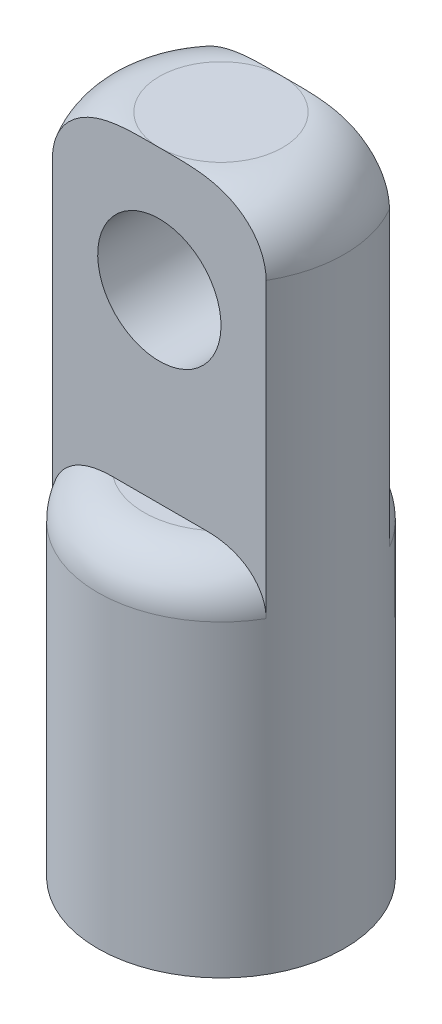
ISO-10303-21;
HEADER;
FILE_DESCRIPTION(('STEP AP214'),'2;1');
FILE_NAME('part.step','',(''),(''),'','','');
FILE_SCHEMA(('AUTOMOTIVE_DESIGN { 1 0 10303 214 1 1 1 1 }'));
ENDSEC;
DATA;
#1=APPLICATION_CONTEXT('core data for automotive mechanical design processes');
#2=APPLICATION_PROTOCOL_DEFINITION('international standard','automotive_design',2000,#1);
#3=PRODUCT_CONTEXT('',#1,'mechanical');
#4=PRODUCT('Part','Part','',(#3));
#5=PRODUCT_RELATED_PRODUCT_CATEGORY('part','',(#4));
#6=PRODUCT_DEFINITION_FORMATION('','',#4);
#7=PRODUCT_DEFINITION_CONTEXT('part definition',#1,'design');
#8=PRODUCT_DEFINITION('design','',#6,#7);
#9=PRODUCT_DEFINITION_SHAPE('','',#8);
#10=(LENGTH_UNIT() NAMED_UNIT(*) SI_UNIT(.MILLI.,.METRE.));
#11=(NAMED_UNIT(*) PLANE_ANGLE_UNIT() SI_UNIT($,.RADIAN.));
#12=(NAMED_UNIT(*) SI_UNIT($,.STERADIAN.) SOLID_ANGLE_UNIT());
#13=UNCERTAINTY_MEASURE_WITH_UNIT(LENGTH_MEASURE(1.E-05),#10,'distance_accuracy_value','');
#14=(GEOMETRIC_REPRESENTATION_CONTEXT(3) GLOBAL_UNCERTAINTY_ASSIGNED_CONTEXT((#13)) GLOBAL_UNIT_ASSIGNED_CONTEXT((#10,
#11,#12)) REPRESENTATION_CONTEXT('',''));
#15=CARTESIAN_POINT('',(0.,0.,0.));
#16=DIRECTION('',(0.,0.,1.));
#17=DIRECTION('',(1.,0.,0.));
#18=AXIS2_PLACEMENT_3D('',#15,#16,#17);
#19=CARTESIAN_POINT('',(0.,43.,0.));
#20=DIRECTION('',(0.,-1.,0.));
#21=DIRECTION('',(0.,0.,-1.));
#22=AXIS2_PLACEMENT_3D('',#19,#20,#21);
#23=CYLINDRICAL_SURFACE('',#22,8.);
#24=DIRECTION('',(0.,-1.,0.));
#25=VECTOR('',#24,1.);
#26=CARTESIAN_POINT('',(6.92820323027551,43.,-4.));
#27=LINE('',#26,#25);
#28=CARTESIAN_POINT('',(6.92820323027551,20.,-4.));
#29=VERTEX_POINT('',#28);
#30=CARTESIAN_POINT('',(6.92820323027551,39.,-4.));
#31=VERTEX_POINT('',#30);
#32=EDGE_CURVE('E111',#29,#31,#27,.F.);
#33=ORIENTED_EDGE('',*,*,#32,.T.);
#34=CARTESIAN_POINT('',(0.,39.,0.));
#35=DIRECTION('',(0.,1.,0.));
#36=DIRECTION('',(0.,0.,1.));
#37=AXIS2_PLACEMENT_3D('',#34,#35,#36);
#38=CIRCLE('',#37,8.);
#39=CARTESIAN_POINT('',(6.92820323027551,39.,4.));
#40=VERTEX_POINT('',#39);
#41=EDGE_CURVE('E57',#31,#40,#38,.F.);
#42=ORIENTED_EDGE('',*,*,#41,.T.);
#43=DIRECTION('',(0.,-1.,0.));
#44=VECTOR('',#43,1.);
#45=CARTESIAN_POINT('',(6.92820323027551,43.,4.));
#46=LINE('',#45,#44);
#47=CARTESIAN_POINT('',(6.92820323027551,20.,4.));
#48=VERTEX_POINT('',#47);
#49=EDGE_CURVE('E137',#40,#48,#46,.T.);
#50=ORIENTED_EDGE('',*,*,#49,.T.);
#51=CARTESIAN_POINT('',(0.,20.,0.));
#52=DIRECTION('',(0.,-1.,0.));
#53=DIRECTION('',(0.,0.,-1.));
#54=AXIS2_PLACEMENT_3D('',#51,#52,#53);
#55=CIRCLE('',#54,8.);
#56=CARTESIAN_POINT('',(-6.92820323027551,20.,4.));
#57=VERTEX_POINT('',#56);
#58=EDGE_CURVE('E128',#48,#57,#55,.T.);
#59=ORIENTED_EDGE('',*,*,#58,.T.);
#60=DIRECTION('',(0.,-1.,0.));
#61=VECTOR('',#60,1.);
#62=CARTESIAN_POINT('',(-6.92820323027551,43.,4.));
#63=LINE('',#62,#61);
#64=CARTESIAN_POINT('',(-6.92820323027551,39.,4.));
#65=VERTEX_POINT('',#64);
#66=EDGE_CURVE('E110',#57,#65,#63,.F.);
#67=ORIENTED_EDGE('',*,*,#66,.T.);
#68=CARTESIAN_POINT('',(0.,39.,0.));
#69=DIRECTION('',(0.,1.,0.));
#70=DIRECTION('',(0.,0.,1.));
#71=AXIS2_PLACEMENT_3D('',#68,#69,#70);
#72=CIRCLE('',#71,8.);
#73=CARTESIAN_POINT('',(-6.92820323027551,39.,-4.));
#74=VERTEX_POINT('',#73);
#75=EDGE_CURVE('E105',#65,#74,#72,.F.);
#76=ORIENTED_EDGE('',*,*,#75,.T.);
#77=DIRECTION('',(0.,-1.,0.));
#78=VECTOR('',#77,1.);
#79=CARTESIAN_POINT('',(-6.92820323027551,43.,-4.));
#80=LINE('',#79,#78);
#81=CARTESIAN_POINT('',(-6.92820323027551,20.,-4.));
#82=VERTEX_POINT('',#81);
#83=EDGE_CURVE('E99',#74,#82,#80,.T.);
#84=ORIENTED_EDGE('',*,*,#83,.T.);
#85=CARTESIAN_POINT('',(0.,20.,0.));
#86=DIRECTION('',(0.,-1.,0.));
#87=DIRECTION('',(0.,0.,-1.));
#88=AXIS2_PLACEMENT_3D('',#85,#86,#87);
#89=CIRCLE('',#88,8.);
#90=EDGE_CURVE('E103',#82,#29,#89,.T.);
#91=ORIENTED_EDGE('',*,*,#90,.T.);
#92=EDGE_LOOP('',(#33,#42,#50,#59,#67,#76,#84,#91));
#93=FACE_BOUND('',#92,.T.);
#94=CARTESIAN_POINT('',(0.,0.,0.));
#95=DIRECTION('',(0.,1.,0.));
#96=DIRECTION('',(0.,0.,1.));
#97=AXIS2_PLACEMENT_3D('',#94,#95,#96);
#98=CIRCLE('',#97,8.);
#99=CARTESIAN_POINT('',(0.,0.,8.));
#100=VERTEX_POINT('',#99);
#101=EDGE_CURVE('E129',#100,#100,#98,.T.);
#102=ORIENTED_EDGE('',*,*,#101,.T.);
#103=EDGE_LOOP('',(#102));
#104=FACE_BOUND('',#103,.T.);
#105=ADVANCED_FACE('F39',(#93,#104),#23,.T.);
#106=CARTESIAN_POINT('',(0.,43.,0.));
#107=DIRECTION('',(0.,1.,0.));
#108=DIRECTION('',(0.,0.,1.));
#109=AXIS2_PLACEMENT_3D('',#106,#107,#108);
#110=PLANE('',#109);
#111=CARTESIAN_POINT('',(0.,43.,0.));
#112=DIRECTION('',(0.,1.,0.));
#113=DIRECTION('',(0.,0.,1.));
#114=AXIS2_PLACEMENT_3D('',#111,#112,#113);
#115=CIRCLE('',#114,4.);
#116=CARTESIAN_POINT('',(0.,43.,-4.));
#117=VERTEX_POINT('',#116);
#118=CARTESIAN_POINT('',(0.,43.,4.));
#119=VERTEX_POINT('',#118);
#120=EDGE_CURVE('E122',#117,#119,#115,.T.);
#121=ORIENTED_EDGE('',*,*,#120,.T.);
#122=CARTESIAN_POINT('',(0.,43.,0.));
#123=DIRECTION('',(0.,1.,0.));
#124=DIRECTION('',(0.,0.,1.));
#125=AXIS2_PLACEMENT_3D('',#122,#123,#124);
#126=CIRCLE('',#125,4.);
#127=EDGE_CURVE('E209',#119,#117,#126,.T.);
#128=ORIENTED_EDGE('',*,*,#127,.T.);
#129=EDGE_LOOP('',(#121,#128));
#130=FACE_BOUND('',#129,.T.);
#131=ADVANCED_FACE('F196',(#130),#110,.T.);
#132=CARTESIAN_POINT('',(0.,0.,0.));
#133=DIRECTION('',(0.,1.,0.));
#134=DIRECTION('',(0.,0.,1.));
#135=AXIS2_PLACEMENT_3D('',#132,#133,#134);
#136=PLANE('',#135);
#137=CARTESIAN_POINT('',(0.,0.,0.));
#138=DIRECTION('',(0.,-1.,0.));
#139=DIRECTION('',(0.,0.,-1.));
#140=AXIS2_PLACEMENT_3D('',#137,#138,#139);
#141=CIRCLE('',#140,4.);
#142=CARTESIAN_POINT('',(0.,0.,-4.));
#143=VERTEX_POINT('',#142);
#144=EDGE_CURVE('E258',#143,#143,#141,.T.);
#145=ORIENTED_EDGE('',*,*,#144,.F.);
#146=EDGE_LOOP('',(#145));
#147=FACE_BOUND('',#146,.T.);
#148=ORIENTED_EDGE('',*,*,#101,.F.);
#149=EDGE_LOOP('',(#148));
#150=FACE_BOUND('',#149,.T.);
#151=ADVANCED_FACE('F289',(#147,#150),#136,.F.);
#152=CARTESIAN_POINT('',(-21.5,23.,-8.));
#153=DIRECTION('',(0.,-1.,0.));
#154=DIRECTION('',(0.,0.,-1.));
#155=AXIS2_PLACEMENT_3D('',#152,#153,#154);
#156=PLANE('',#155);
#157=DIRECTION('',(1.,0.,0.));
#158=VECTOR('',#157,1.);
#159=CARTESIAN_POINT('',(-21.5,23.,-4.));
#160=LINE('',#159,#158);
#161=CARTESIAN_POINT('',(-3.,23.,-4.));
#162=VERTEX_POINT('',#161);
#163=CARTESIAN_POINT('',(3.,23.,-4.));
#164=VERTEX_POINT('',#163);
#165=EDGE_CURVE('E118',#162,#164,#160,.T.);
#166=ORIENTED_EDGE('',*,*,#165,.T.);
#167=CARTESIAN_POINT('',(0.,23.,0.));
#168=DIRECTION('',(0.,-1.,0.));
#169=DIRECTION('',(0.,0.,-1.));
#170=AXIS2_PLACEMENT_3D('',#167,#168,#169);
#171=CIRCLE('',#170,5.);
#172=EDGE_CURVE('E143',#164,#162,#171,.F.);
#173=ORIENTED_EDGE('',*,*,#172,.T.);
#174=EDGE_LOOP('',(#166,#173));
#175=FACE_BOUND('',#174,.T.);
#176=ADVANCED_FACE('F194',(#175),#156,.F.);
#177=CARTESIAN_POINT('',(-21.5,43.,-4.));
#178=DIRECTION('',(0.,0.,1.));
#179=DIRECTION('',(0.,-1.,0.));
#180=AXIS2_PLACEMENT_3D('',#177,#178,#179);
#181=PLANE('',#180);
#182=CARTESIAN_POINT('',(0.,35.,-4.));
#183=DIRECTION('',(0.,0.,1.));
#184=DIRECTION('',(0.,-1.,0.));
#185=AXIS2_PLACEMENT_3D('',#182,#183,#184);
#186=CIRCLE('',#185,4.);
#187=CARTESIAN_POINT('',(0.,31.,-4.));
#188=VERTEX_POINT('',#187);
#189=EDGE_CURVE('E252',#188,#188,#186,.T.);
#190=ORIENTED_EDGE('',*,*,#189,.T.);
#191=EDGE_LOOP('',(#190));
#192=FACE_BOUND('',#191,.T.);
#193=CARTESIAN_POINT('',(-6.92820323027551,39.,-4.));
#194=CARTESIAN_POINT('',(-6.92821776572525,39.0998399111443,-4.));
#195=CARTESIAN_POINT('',(-6.92388723160754,39.1996728618451,-4.));
#196=CARTESIAN_POINT('',(-6.906647552131,39.3985770249255,-4.));
#197=CARTESIAN_POINT('',(-6.89374002173262,39.4976483771546,-4.));
#198=CARTESIAN_POINT('',(-6.85950468274296,39.6940507034913,-4.));
#199=CARTESIAN_POINT('',(-6.83820000104996,39.7913856965822,-4.));
#200=CARTESIAN_POINT('',(-6.78740665520392,39.9838692326013,-4.));
#201=CARTESIAN_POINT('',(-6.75791788751632,40.0790177478524,-4.));
#202=CARTESIAN_POINT('',(-6.65758013373837,40.3601476261152,-4.));
#203=CARTESIAN_POINT('',(-6.57482183418598,40.5420274197596,-4.));
#204=CARTESIAN_POINT('',(-6.38079408621659,40.8897213590252,-4.));
#205=CARTESIAN_POINT('',(-6.26951878887343,41.055532199227,-4.));
#206=CARTESIAN_POINT('',(-6.01890175588109,41.3720723169723,-4.));
#207=CARTESIAN_POINT('',(-5.87885522019734,41.5222423955989,-4.));
#208=CARTESIAN_POINT('',(-5.57755711087018,41.7995318758743,-4.));
#209=CARTESIAN_POINT('',(-5.41629284782276,41.9266373745056,-4.));
#210=CARTESIAN_POINT('',(-5.06022269741182,42.1684660542635,-4.));
#211=CARTESIAN_POINT('',(-4.86367344855326,42.2806090561814,-4.));
#212=CARTESIAN_POINT('',(-4.45717854161851,42.476146937675,-4.));
#213=CARTESIAN_POINT('',(-4.24724433860506,42.5595660184323,-4.));
#214=CARTESIAN_POINT('',(-3.84336634720423,42.6923183290874,-4.));
#215=CARTESIAN_POINT('',(-3.65031767030763,42.74444835051,-4.));
#216=CARTESIAN_POINT('',(-3.26023127878528,42.8310128825349,-4.));
#217=CARTESIAN_POINT('',(-3.06319062513511,42.8654338236988,-4.));
#218=CARTESIAN_POINT('',(-2.46673820887158,42.9475472888336,-4.));
#219=CARTESIAN_POINT('',(-2.06447214576943,42.9733763896873,-4.));
#220=CARTESIAN_POINT('',(-1.52297472200008,42.9906786600553,-4.));
#221=CARTESIAN_POINT('',(-1.38356663355005,42.9935726212859,-4.));
#222=CARTESIAN_POINT('',(-1.10470452891646,42.997490418453,-4.));
#223=CARTESIAN_POINT('',(-0.965250517883453,42.9985144197157,-4.));
#224=CARTESIAN_POINT('',(-0.688164141979116,42.9996987371187,-4.));
#225=CARTESIAN_POINT('',(-0.550531671165758,42.9998701116947,-4.));
#226=CARTESIAN_POINT('',(-0.344082100049704,42.9999802422005,-4.));
#227=CARTESIAN_POINT('',(-0.27526620443901,42.9999924644965,-4.));
#228=CARTESIAN_POINT('',(-0.137633406118068,43.0000004488545,-4.));
#229=CARTESIAN_POINT('',(-0.068816503407787,42.999996210676,-4.));
#230=CARTESIAN_POINT('',(0.,43.,-4.));
#231=B_SPLINE_CURVE_WITH_KNOTS('',3,(#193,#194,#195,#196,#197,#198,#199,#200,#201,#202,#203,
#204,#205,#206,#207,#208,#209,#210,#211,#212,#213,#214,#215,#216,#217,#218,#219,#220,#221,#222,
#223,#224,#225,#226,#227,#228,#229,#230),.UNSPECIFIED.,.F.,.F.,(4,2,2,2,2,2,2,2,2,2,2,2,2,2,2,2,
2,2,4),(0.,0.299413909240484,0.59877145788006,0.897310232380029,1.195852783782,1.79229394062821,
2.38885752747876,3.00229397422898,3.61609897267758,4.29242836735668,4.96818652204701,
5.56712678431675,6.16652529871814,7.37296410521326,7.79134521533999,8.20968933390621,
8.62259318706088,8.82904048026419,9.03549078799542),.UNSPECIFIED.);
#232=EDGE_CURVE('E202',#74,#117,#231,.T.);
#233=ORIENTED_EDGE('',*,*,#232,.T.);
#234=CARTESIAN_POINT('',(0.,43.,-4.));
#235=CARTESIAN_POINT('',(0.081934372443785,42.9999901621517,-4.));
#236=CARTESIAN_POINT('',(0.163868719645012,42.9999997722504,-4.));
#237=CARTESIAN_POINT('',(0.327737805392751,42.9999859949028,-4.));
#238=CARTESIAN_POINT('',(0.409672543939226,42.9999626072957,-4.));
#239=CARTESIAN_POINT('',(0.573570543917074,42.9998109134264,-4.));
#240=CARTESIAN_POINT('',(0.655533805360718,42.9996825706882,-4.));
#241=CARTESIAN_POINT('',(0.819459431287918,42.9991810018759,-4.));
#242=CARTESIAN_POINT('',(0.901421795771103,42.9988077757041,-4.));
#243=CARTESIAN_POINT('',(1.14971087828171,42.9970462778812,-4.));
#244=CARTESIAN_POINT('',(1.31603543743134,42.9950086297618,-4.));
#245=CARTESIAN_POINT('',(1.64860104925505,42.9873060204224,-4.));
#246=CARTESIAN_POINT('',(1.81484210786678,42.9816413702565,-4.));
#247=CARTESIAN_POINT('',(2.15225389122415,42.9641651516034,-4.));
#248=CARTESIAN_POINT('',(2.32341585058205,42.9521665237094,-4.));
#249=CARTESIAN_POINT('',(2.66496525353369,42.9193839211801,-4.));
#250=CARTESIAN_POINT('',(2.83535258957369,42.8985987620824,-4.));
#251=CARTESIAN_POINT('',(3.17336577789354,42.8460148114359,-4.));
#252=CARTESIAN_POINT('',(3.34100226920973,42.8142863109191,-4.));
#253=CARTESIAN_POINT('',(3.6732189151806,42.7377303589657,-4.));
#254=CARTESIAN_POINT('',(3.83780106037201,42.6929117818376,-4.));
#255=CARTESIAN_POINT('',(4.10928317228068,42.6055533932505,-4.));
#256=CARTESIAN_POINT('',(4.21748448205684,42.5670403097285,-4.));
#257=CARTESIAN_POINT('',(4.43119367088118,42.4828941875974,-4.));
#258=CARTESIAN_POINT('',(4.5366995171093,42.4372559497635,-4.));
#259=CARTESIAN_POINT('',(4.7435746413122,42.33890351358,-4.));
#260=CARTESIAN_POINT('',(4.84496540499679,42.286234656278,-4.));
#261=CARTESIAN_POINT('',(5.04351882719218,42.1734588811268,-4.));
#262=CARTESIAN_POINT('',(5.14068203496346,42.1133529334571,-4.));
#263=CARTESIAN_POINT('',(5.33084233404043,41.9850905467794,-4.));
#264=CARTESIAN_POINT('',(5.42379364032934,41.9168660282979,-4.));
#265=CARTESIAN_POINT('',(5.60367287221488,41.7729559608496,-4.));
#266=CARTESIAN_POINT('',(5.69060355893645,41.697273871113,-4.));
#267=CARTESIAN_POINT('',(5.8577956090825,41.5385089166943,-4.));
#268=CARTESIAN_POINT('',(5.93804212292043,41.4554103810236,-4.));
#269=CARTESIAN_POINT('',(6.09075270962902,41.282401115125,-4.));
#270=CARTESIAN_POINT('',(6.16322032727889,41.1924935198596,-4.));
#271=CARTESIAN_POINT('',(6.29841885913387,41.0079794642972,-4.));
#272=CARTESIAN_POINT('',(6.36129497454657,40.9134795308043,-4.));
#273=CARTESIAN_POINT('',(6.478008414938,40.7191093874048,-4.));
#274=CARTESIAN_POINT('',(6.53185012066076,40.6192418114419,-4.));
#275=CARTESIAN_POINT('',(6.62983314141406,40.4149641819472,-4.));
#276=CARTESIAN_POINT('',(6.67398386175297,40.3105586515818,-4.));
#277=CARTESIAN_POINT('',(6.75208657385242,40.0980553359509,-4.));
#278=CARTESIAN_POINT('',(6.78604185230073,39.989958753106,-4.));
#279=CARTESIAN_POINT('',(6.85224077542441,39.7369052635637,-4.));
#280=CARTESIAN_POINT('',(6.88068089681158,39.5909227529622,-4.));
#281=CARTESIAN_POINT('',(6.90916776843233,39.3702365449814,-4.));
#282=CARTESIAN_POINT('',(6.91630118155305,39.2963752911566,-4.));
#283=CARTESIAN_POINT('',(6.9258187589002,39.1483507577692,-4.));
#284=CARTESIAN_POINT('',(6.92820313405676,39.0741874917672,-4.));
#285=CARTESIAN_POINT('',(6.92820323027551,39.,-4.));
#286=B_SPLINE_CURVE_WITH_KNOTS('',3,(#234,#235,#236,#237,#238,#239,#240,#241,#242,#243,#244,
#245,#246,#247,#248,#249,#250,#251,#252,#253,#254,#255,#256,#257,#258,#259,#260,#261,#262,#263,
#264,#265,#266,#267,#268,#269,#270,#271,#272,#273,#274,#275,#276,#277,#278,#279,#280,#281,#282,
#283,#284,#285),.UNSPECIFIED.,.F.,.F.,(4,2,2,2,2,2,2,2,2,2,2,2,2,2,2,2,2,2,2,2,2,2,2,2,2,4),(0.,
0.245803063149239,0.491607323134588,0.737497045914827,0.983386866876634,1.48237884806241,
1.9813280410932,2.49591247390099,3.01056629704422,3.52197414124778,4.03303608235375,
4.37736922216389,4.7219548064554,5.06441677992871,5.40683412573429,5.75235749828527,
6.09772134594152,6.44383305523808,6.78978636865603,7.12982893983612,7.46970614643276,
7.80925202196232,8.14868832083924,8.59349612486315,8.81598209166226,9.03845817645166),.UNSPECIFIED.);
#287=EDGE_CURVE('E208',#117,#31,#286,.T.);
#288=ORIENTED_EDGE('',*,*,#287,.T.);
#289=ORIENTED_EDGE('',*,*,#32,.F.);
#290=CARTESIAN_POINT('',(6.92820323027551,20.,-4.));
#291=CARTESIAN_POINT('',(6.92821515785234,20.0752775190238,-4.));
#292=CARTESIAN_POINT('',(6.92493181108223,20.1505492919052,-4.));
#293=CARTESIAN_POINT('',(6.91186600404405,20.3005102095571,-4.));
#294=CARTESIAN_POINT('',(6.90208500321219,20.3751994813523,-4.));
#295=CARTESIAN_POINT('',(6.87615954702359,20.5232056612017,-4.));
#296=CARTESIAN_POINT('',(6.86003691523257,20.5965263819242,-4.));
#297=CARTESIAN_POINT('',(6.82161828999906,20.7415122597936,-4.));
#298=CARTESIAN_POINT('',(6.79932217546066,20.8131773844353,-4.));
#299=CARTESIAN_POINT('',(6.72351159434413,21.0248826158747,-4.));
#300=CARTESIAN_POINT('',(6.66104059206544,21.161825161522,-4.));
#301=CARTESIAN_POINT('',(6.51474411865975,21.4237355839381,-4.));
#302=CARTESIAN_POINT('',(6.43090434521203,21.5486953631329,-4.));
#303=CARTESIAN_POINT('',(6.24166906471507,21.7882488572285,-4.));
#304=CARTESIAN_POINT('',(6.13562135211106,21.9023261251878,-4.));
#305=CARTESIAN_POINT('',(5.90770601111562,22.1131163730114,-4.));
#306=CARTESIAN_POINT('',(5.78584584640996,22.2098374942024,-4.));
#307=CARTESIAN_POINT('',(5.51552898292012,22.3951528248614,-4.));
#308=CARTESIAN_POINT('',(5.36562212174723,22.4816220518126,-4.));
#309=CARTESIAN_POINT('',(5.05475755977353,22.632904826468,-4.));
#310=CARTESIAN_POINT('',(4.89376362208769,22.6976428644215,-4.));
#311=CARTESIAN_POINT('',(4.59000989723978,22.7982840230494,-4.));
#312=CARTESIAN_POINT('',(4.44818121058739,22.8370692672232,-4.));
#313=CARTESIAN_POINT('',(4.16133779887817,22.9012546895422,-4.));
#314=CARTESIAN_POINT('',(4.01631852565651,22.9266342705923,-4.));
#315=CARTESIAN_POINT('',(3.72609336968325,22.9654099032293,-4.));
#316=CARTESIAN_POINT('',(3.58090097086085,22.978911989111,-4.));
#317=CARTESIAN_POINT('',(3.29042531426347,22.9962063057846,-4.));
#318=CARTESIAN_POINT('',(3.14514413551115,23.0000322025836,-4.));
#319=CARTESIAN_POINT('',(3.,23.,-4.));
#320=B_SPLINE_CURVE_WITH_KNOTS('',3,(#290,#291,#292,#293,#294,#295,#296,#297,#298,#299,#300,
#301,#302,#303,#304,#305,#306,#307,#308,#309,#310,#311,#312,#313,#314,#315,#316,#317,#318,#319),
.UNSPECIFIED.,.F.,.F.,(4,2,2,2,2,2,2,2,2,2,2,2,2,2,4),(0.,0.22575120161146,0.451451714446731,
0.676382221689015,0.901317141366401,1.35060763244558,1.80019963122215,2.26554049563833,
2.73066250663503,3.24790157623515,3.76691973836386,4.2073338211855,4.64842262307914,
5.08553250731007,5.52111946598815),.UNSPECIFIED.);
#321=EDGE_CURVE('E123',#29,#164,#320,.T.);
#322=ORIENTED_EDGE('',*,*,#321,.T.);
#323=ORIENTED_EDGE('',*,*,#165,.F.);
#324=CARTESIAN_POINT('',(-3.,23.,-4.));
#325=CARTESIAN_POINT('',(-3.08434272344486,23.0000016002259,-4.));
#326=CARTESIAN_POINT('',(-3.16868679855583,22.9987188299357,-4.));
#327=CARTESIAN_POINT('',(-3.33731651653949,22.9931870540305,-4.));
#328=CARTESIAN_POINT('',(-3.42160211075298,22.9889365999714,-4.));
#329=CARTESIAN_POINT('',(-3.67504906760694,22.9710755177816,-4.));
#330=CARTESIAN_POINT('',(-3.84390289401351,22.9523465293852,-4.));
#331=CARTESIAN_POINT('',(-4.18095001020976,22.8980939374492,-4.));
#332=CARTESIAN_POINT('',(-4.34911395744236,22.8623817881528,-4.));
#333=CARTESIAN_POINT('',(-4.67982491206461,22.7717148283789,-4.));
#334=CARTESIAN_POINT('',(-4.84238521427837,22.7168095847979,-4.));
#335=CARTESIAN_POINT('',(-5.1702374673215,22.5812701219929,-4.));
#336=CARTESIAN_POINT('',(-5.3348968054154,22.4990796967319,-4.));
#337=CARTESIAN_POINT('',(-5.6486006857123,22.3098016651211,-4.));
#338=CARTESIAN_POINT('',(-5.79770842343214,22.2028210085389,-4.));
#339=CARTESIAN_POINT('',(-6.00627938118596,22.023702953418,-4.));
#340=CARTESIAN_POINT('',(-6.07357918351382,21.9605339343775,-4.));
#341=CARTESIAN_POINT('',(-6.20210301540641,21.8283072962409,-4.));
#342=CARTESIAN_POINT('',(-6.26332988076576,21.7592524538421,-4.));
#343=CARTESIAN_POINT('',(-6.37902751921047,21.6155436084111,-4.));
#344=CARTESIAN_POINT('',(-6.43348928259466,21.5408823465718,-4.));
#345=CARTESIAN_POINT('',(-6.53482654137611,21.3865797398213,-4.));
#346=CARTESIAN_POINT('',(-6.58170333007885,21.3069392471307,-4.));
#347=CARTESIAN_POINT('',(-6.6626549051383,21.1520467355503,-4.));
#348=CARTESIAN_POINT('',(-6.69756086224048,21.0772281837687,-4.));
#349=CARTESIAN_POINT('',(-6.76036031824398,20.9247076089031,-4.));
#350=CARTESIAN_POINT('',(-6.78825478272786,20.8470059845526,-4.));
#351=CARTESIAN_POINT('',(-6.83663475845921,20.6895080969794,-4.));
#352=CARTESIAN_POINT('',(-6.85713564303521,20.6097165544316,-4.));
#353=CARTESIAN_POINT('',(-6.89053740625693,20.4485962898993,-4.));
#354=CARTESIAN_POINT('',(-6.90344301296172,20.3672685568088,-4.));
#355=CARTESIAN_POINT('',(-6.91771335342593,20.2380964446396,-4.));
#356=CARTESIAN_POINT('',(-6.92164844083313,20.1905222385129,-4.));
#357=CARTESIAN_POINT('',(-6.9268919021678,20.0953009516296,-4.));
#358=CARTESIAN_POINT('',(-6.92820420890376,20.0476540873583,-4.));
#359=CARTESIAN_POINT('',(-6.92820323027601,20.,-4.));
#360=B_SPLINE_CURVE_WITH_KNOTS('',3,(#324,#325,#326,#327,#328,#329,#330,#331,#332,#333,#334,
#335,#336,#337,#338,#339,#340,#341,#342,#343,#344,#345,#346,#347,#348,#349,#350,#351,#352,#353,
#354,#355,#356,#357,#358,#359),.UNSPECIFIED.,.F.,.F.,(4,2,2,2,2,2,2,2,2,2,2,2,2,2,2,2,2,4),(0.,
0.253013430789428,0.506150436802284,1.01511086567278,1.52985855421584,2.04328659031308,
2.5933464679205,3.14107606603442,3.41765749619675,3.69410916088372,3.9709251414229,
4.24769387252929,4.49504100646621,4.74235405848861,4.9891498714192,5.23579189105644,
5.37893661090249,5.52186652650744),.UNSPECIFIED.);
#361=EDGE_CURVE('E115',#162,#82,#360,.T.);
#362=ORIENTED_EDGE('',*,*,#361,.T.);
#363=ORIENTED_EDGE('',*,*,#83,.F.);
#364=EDGE_LOOP('',(#233,#288,#289,#322,#323,#362,#363));
#365=FACE_BOUND('',#364,.T.);
#366=ADVANCED_FACE('F116',(#192,#365),#181,.F.);
#367=CARTESIAN_POINT('',(-21.5,23.,8.));
#368=DIRECTION('',(0.,-1.,0.));
#369=DIRECTION('',(0.,0.,-1.));
#370=AXIS2_PLACEMENT_3D('',#367,#368,#369);
#371=PLANE('',#370);
#372=DIRECTION('',(1.,0.,0.));
#373=VECTOR('',#372,1.);
#374=CARTESIAN_POINT('',(-21.5,23.,4.));
#375=LINE('',#374,#373);
#376=CARTESIAN_POINT('',(-3.,23.,4.));
#377=VERTEX_POINT('',#376);
#378=CARTESIAN_POINT('',(3.,23.,4.));
#379=VERTEX_POINT('',#378);
#380=EDGE_CURVE('E241',#377,#379,#375,.T.);
#381=ORIENTED_EDGE('',*,*,#380,.F.);
#382=CARTESIAN_POINT('',(0.,23.,0.));
#383=DIRECTION('',(0.,-1.,0.));
#384=DIRECTION('',(0.,0.,-1.));
#385=AXIS2_PLACEMENT_3D('',#382,#383,#384);
#386=CIRCLE('',#385,5.);
#387=EDGE_CURVE('E134',#377,#379,#386,.F.);
#388=ORIENTED_EDGE('',*,*,#387,.T.);
#389=EDGE_LOOP('',(#381,#388));
#390=FACE_BOUND('',#389,.T.);
#391=ADVANCED_FACE('F193',(#390),#371,.F.);
#392=CARTESIAN_POINT('',(-21.5,43.,4.));
#393=DIRECTION('',(0.,0.,-1.));
#394=DIRECTION('',(0.,1.,0.));
#395=AXIS2_PLACEMENT_3D('',#392,#393,#394);
#396=PLANE('',#395);
#397=CARTESIAN_POINT('',(0.,35.,4.));
#398=DIRECTION('',(0.,0.,-1.));
#399=DIRECTION('',(0.,1.,0.));
#400=AXIS2_PLACEMENT_3D('',#397,#398,#399);
#401=CIRCLE('',#400,4.);
#402=CARTESIAN_POINT('',(0.,39.,4.));
#403=VERTEX_POINT('',#402);
#404=EDGE_CURVE('E44',#403,#403,#401,.T.);
#405=ORIENTED_EDGE('',*,*,#404,.T.);
#406=EDGE_LOOP('',(#405));
#407=FACE_BOUND('',#406,.T.);
#408=ORIENTED_EDGE('',*,*,#49,.F.);
#409=CARTESIAN_POINT('',(6.92820323027551,39.,4.));
#410=CARTESIAN_POINT('',(6.92821776572525,39.0998399111443,4.));
#411=CARTESIAN_POINT('',(6.92388723160754,39.1996728618451,4.));
#412=CARTESIAN_POINT('',(6.906647552131,39.3985770249255,4.));
#413=CARTESIAN_POINT('',(6.89374002173262,39.4976483771546,4.));
#414=CARTESIAN_POINT('',(6.85950468274296,39.6940507034913,4.));
#415=CARTESIAN_POINT('',(6.83820000104996,39.7913856965822,4.));
#416=CARTESIAN_POINT('',(6.78740665520392,39.9838692326013,4.));
#417=CARTESIAN_POINT('',(6.75791788751632,40.0790177478524,4.));
#418=CARTESIAN_POINT('',(6.65758013373837,40.3601476261152,4.));
#419=CARTESIAN_POINT('',(6.57482183418598,40.5420274197596,4.));
#420=CARTESIAN_POINT('',(6.38079408621659,40.8897213590252,4.));
#421=CARTESIAN_POINT('',(6.26951878887343,41.055532199227,4.));
#422=CARTESIAN_POINT('',(6.01890175588109,41.3720723169723,4.));
#423=CARTESIAN_POINT('',(5.87885522019734,41.5222423955989,4.));
#424=CARTESIAN_POINT('',(5.57755711087018,41.7995318758743,4.));
#425=CARTESIAN_POINT('',(5.41629284782276,41.9266373745056,4.));
#426=CARTESIAN_POINT('',(5.06022269741182,42.1684660542635,4.));
#427=CARTESIAN_POINT('',(4.86367344855326,42.2806090561814,4.));
#428=CARTESIAN_POINT('',(4.45717854161851,42.476146937675,4.));
#429=CARTESIAN_POINT('',(4.24724433860506,42.5595660184323,4.));
#430=CARTESIAN_POINT('',(3.84336634720423,42.6923183290874,4.));
#431=CARTESIAN_POINT('',(3.65031767030763,42.74444835051,4.));
#432=CARTESIAN_POINT('',(3.26023127878528,42.8310128825349,4.));
#433=CARTESIAN_POINT('',(3.06319062513511,42.8654338236988,4.));
#434=CARTESIAN_POINT('',(2.46673820887158,42.9475472888336,4.));
#435=CARTESIAN_POINT('',(2.06447214576943,42.9733763896873,4.));
#436=CARTESIAN_POINT('',(1.52297472200008,42.9906786600553,4.));
#437=CARTESIAN_POINT('',(1.38356663355005,42.9935726212859,4.));
#438=CARTESIAN_POINT('',(1.10470452891646,42.997490418453,4.));
#439=CARTESIAN_POINT('',(0.965250517883453,42.9985144197157,4.));
#440=CARTESIAN_POINT('',(0.688164141979116,42.9996987371187,4.));
#441=CARTESIAN_POINT('',(0.550531671165758,42.9998701116947,4.));
#442=CARTESIAN_POINT('',(0.344082100049704,42.9999802422005,4.));
#443=CARTESIAN_POINT('',(0.27526620443901,42.9999924644965,4.));
#444=CARTESIAN_POINT('',(0.137633406118068,43.0000004488545,4.));
#445=CARTESIAN_POINT('',(0.068816503407787,42.999996210676,4.));
#446=CARTESIAN_POINT('',(0.,43.,4.));
#447=B_SPLINE_CURVE_WITH_KNOTS('',3,(#409,#410,#411,#412,#413,#414,#415,#416,#417,#418,#419,
#420,#421,#422,#423,#424,#425,#426,#427,#428,#429,#430,#431,#432,#433,#434,#435,#436,#437,#438,
#439,#440,#441,#442,#443,#444,#445,#446),.UNSPECIFIED.,.F.,.F.,(4,2,2,2,2,2,2,2,2,2,2,2,2,2,2,2,
2,2,4),(0.,0.299413909240484,0.59877145788006,0.897310232380029,1.195852783782,1.79229394062821,
2.38885752747876,3.00229397422898,3.61609897267758,4.29242836735668,4.96818652204701,
5.56712678431675,6.16652529871814,7.37296410521326,7.79134521533999,8.20968933390621,
8.62259318706088,8.82904048026419,9.03549078799542),.UNSPECIFIED.);
#448=EDGE_CURVE('E11',#40,#119,#447,.T.);
#449=ORIENTED_EDGE('',*,*,#448,.T.);
#450=CARTESIAN_POINT('',(0.,43.,4.));
#451=CARTESIAN_POINT('',(-0.081934372443785,42.9999901621517,4.));
#452=CARTESIAN_POINT('',(-0.163868719645012,42.9999997722504,4.));
#453=CARTESIAN_POINT('',(-0.327737805392751,42.9999859949028,4.));
#454=CARTESIAN_POINT('',(-0.409672543939226,42.9999626072957,4.));
#455=CARTESIAN_POINT('',(-0.573570543917074,42.9998109134264,4.));
#456=CARTESIAN_POINT('',(-0.655533805360718,42.9996825706882,4.));
#457=CARTESIAN_POINT('',(-0.819459431287918,42.9991810018759,4.));
#458=CARTESIAN_POINT('',(-0.901421795771103,42.9988077757041,4.));
#459=CARTESIAN_POINT('',(-1.14971087828171,42.9970462778812,4.));
#460=CARTESIAN_POINT('',(-1.31603543743134,42.9950086297618,4.));
#461=CARTESIAN_POINT('',(-1.64860104925505,42.9873060204224,4.));
#462=CARTESIAN_POINT('',(-1.81484210786678,42.9816413702565,4.));
#463=CARTESIAN_POINT('',(-2.15225389122415,42.9641651516034,4.));
#464=CARTESIAN_POINT('',(-2.32341585058205,42.9521665237094,4.));
#465=CARTESIAN_POINT('',(-2.66496525353369,42.9193839211801,4.));
#466=CARTESIAN_POINT('',(-2.83535258957369,42.8985987620824,4.));
#467=CARTESIAN_POINT('',(-3.17336577789354,42.8460148114359,4.));
#468=CARTESIAN_POINT('',(-3.34100226920973,42.8142863109191,4.));
#469=CARTESIAN_POINT('',(-3.6732189151806,42.7377303589657,4.));
#470=CARTESIAN_POINT('',(-3.83780106037201,42.6929117818376,4.));
#471=CARTESIAN_POINT('',(-4.10928317228068,42.6055533932505,4.));
#472=CARTESIAN_POINT('',(-4.21748448205684,42.5670403097285,4.));
#473=CARTESIAN_POINT('',(-4.43119367088118,42.4828941875974,4.));
#474=CARTESIAN_POINT('',(-4.5366995171093,42.4372559497635,4.));
#475=CARTESIAN_POINT('',(-4.7435746413122,42.33890351358,4.));
#476=CARTESIAN_POINT('',(-4.84496540499679,42.286234656278,4.));
#477=CARTESIAN_POINT('',(-5.04351882719218,42.1734588811268,4.));
#478=CARTESIAN_POINT('',(-5.14068203496346,42.1133529334571,4.));
#479=CARTESIAN_POINT('',(-5.33084233404043,41.9850905467794,4.));
#480=CARTESIAN_POINT('',(-5.42379364032934,41.9168660282979,4.));
#481=CARTESIAN_POINT('',(-5.60367287221488,41.7729559608496,4.));
#482=CARTESIAN_POINT('',(-5.69060355893645,41.697273871113,4.));
#483=CARTESIAN_POINT('',(-5.8577956090825,41.5385089166943,4.));
#484=CARTESIAN_POINT('',(-5.93804212292043,41.4554103810236,4.));
#485=CARTESIAN_POINT('',(-6.09075270962902,41.282401115125,4.));
#486=CARTESIAN_POINT('',(-6.16322032727889,41.1924935198596,4.));
#487=CARTESIAN_POINT('',(-6.29841885913387,41.0079794642972,4.));
#488=CARTESIAN_POINT('',(-6.36129497454657,40.9134795308043,4.));
#489=CARTESIAN_POINT('',(-6.478008414938,40.7191093874048,4.));
#490=CARTESIAN_POINT('',(-6.53185012066076,40.6192418114419,4.));
#491=CARTESIAN_POINT('',(-6.62983314141406,40.4149641819472,4.));
#492=CARTESIAN_POINT('',(-6.67398386175297,40.3105586515818,4.));
#493=CARTESIAN_POINT('',(-6.75208657385242,40.0980553359509,4.));
#494=CARTESIAN_POINT('',(-6.78604185230073,39.989958753106,4.));
#495=CARTESIAN_POINT('',(-6.85224077542441,39.7369052635637,4.));
#496=CARTESIAN_POINT('',(-6.88068089681158,39.5909227529622,4.));
#497=CARTESIAN_POINT('',(-6.90916776843233,39.3702365449814,4.));
#498=CARTESIAN_POINT('',(-6.91630118155305,39.2963752911566,4.));
#499=CARTESIAN_POINT('',(-6.9258187589002,39.1483507577692,4.));
#500=CARTESIAN_POINT('',(-6.92820313405676,39.0741874917672,4.));
#501=CARTESIAN_POINT('',(-6.92820323027551,39.,4.));
#502=B_SPLINE_CURVE_WITH_KNOTS('',3,(#450,#451,#452,#453,#454,#455,#456,#457,#458,#459,#460,
#461,#462,#463,#464,#465,#466,#467,#468,#469,#470,#471,#472,#473,#474,#475,#476,#477,#478,#479,
#480,#481,#482,#483,#484,#485,#486,#487,#488,#489,#490,#491,#492,#493,#494,#495,#496,#497,#498,
#499,#500,#501),.UNSPECIFIED.,.F.,.F.,(4,2,2,2,2,2,2,2,2,2,2,2,2,2,2,2,2,2,2,2,2,2,2,2,2,4),(0.,
0.245803063149239,0.491607323134588,0.737497045914827,0.983386866876634,1.48237884806241,
1.9813280410932,2.49591247390099,3.01056629704422,3.52197414124778,4.03303608235375,
4.37736922216389,4.7219548064554,5.06441677992871,5.40683412573429,5.75235749828527,
6.09772134594152,6.44383305523808,6.78978636865603,7.12982893983612,7.46970614643276,
7.80925202196232,8.14868832083924,8.59349612486315,8.81598209166226,9.03845817645166),.UNSPECIFIED.);
#503=EDGE_CURVE('E50',#119,#65,#502,.T.);
#504=ORIENTED_EDGE('',*,*,#503,.T.);
#505=ORIENTED_EDGE('',*,*,#66,.F.);
#506=CARTESIAN_POINT('',(-6.92820323027551,20.,4.));
#507=CARTESIAN_POINT('',(-6.92821515785234,20.0752775190238,4.));
#508=CARTESIAN_POINT('',(-6.92493181108223,20.1505492919052,4.));
#509=CARTESIAN_POINT('',(-6.91186600404405,20.300510209557,4.));
#510=CARTESIAN_POINT('',(-6.90208500321219,20.3751994813523,4.));
#511=CARTESIAN_POINT('',(-6.87615954702359,20.5232056612017,4.));
#512=CARTESIAN_POINT('',(-6.86003691523257,20.5965263819242,4.));
#513=CARTESIAN_POINT('',(-6.82161828999906,20.7415122597936,4.));
#514=CARTESIAN_POINT('',(-6.79932217546066,20.8131773844353,4.));
#515=CARTESIAN_POINT('',(-6.72351159434413,21.0248826158747,4.));
#516=CARTESIAN_POINT('',(-6.66104059206544,21.161825161522,4.));
#517=CARTESIAN_POINT('',(-6.51474411865975,21.4237355839381,4.));
#518=CARTESIAN_POINT('',(-6.43090434521203,21.5486953631329,4.));
#519=CARTESIAN_POINT('',(-6.24166906471507,21.7882488572285,4.));
#520=CARTESIAN_POINT('',(-6.13562135211106,21.9023261251878,4.));
#521=CARTESIAN_POINT('',(-5.90770601111562,22.1131163730114,4.));
#522=CARTESIAN_POINT('',(-5.78584584640996,22.2098374942024,4.));
#523=CARTESIAN_POINT('',(-5.51552898292012,22.3951528248613,4.));
#524=CARTESIAN_POINT('',(-5.36562212174723,22.4816220518126,4.));
#525=CARTESIAN_POINT('',(-5.05475755977353,22.632904826468,4.));
#526=CARTESIAN_POINT('',(-4.89376362208769,22.6976428644215,4.));
#527=CARTESIAN_POINT('',(-4.59000989723978,22.7982840230494,4.));
#528=CARTESIAN_POINT('',(-4.44818121058739,22.8370692672232,4.));
#529=CARTESIAN_POINT('',(-4.16133779887817,22.9012546895422,4.));
#530=CARTESIAN_POINT('',(-4.01631852565651,22.9266342705923,4.));
#531=CARTESIAN_POINT('',(-3.72609336968325,22.9654099032293,4.));
#532=CARTESIAN_POINT('',(-3.58090097086085,22.978911989111,4.));
#533=CARTESIAN_POINT('',(-3.29042531426347,22.9962063057846,4.));
#534=CARTESIAN_POINT('',(-3.14514413551115,23.0000322025836,4.));
#535=CARTESIAN_POINT('',(-3.,23.,4.));
#536=B_SPLINE_CURVE_WITH_KNOTS('',3,(#506,#507,#508,#509,#510,#511,#512,#513,#514,#515,#516,
#517,#518,#519,#520,#521,#522,#523,#524,#525,#526,#527,#528,#529,#530,#531,#532,#533,#534,#535),
.UNSPECIFIED.,.F.,.F.,(4,2,2,2,2,2,2,2,2,2,2,2,2,2,4),(0.,0.225751201611457,0.451451714446731,
0.676382221689015,0.901317141366401,1.35060763244558,1.80019963122215,2.26554049563833,
2.73066250663503,3.24790157623515,3.76691973836386,4.2073338211855,4.64842262307914,
5.08553250731007,5.52111946598815),.UNSPECIFIED.);
#537=EDGE_CURVE('E146',#57,#377,#536,.T.);
#538=ORIENTED_EDGE('',*,*,#537,.T.);
#539=ORIENTED_EDGE('',*,*,#380,.T.);
#540=CARTESIAN_POINT('',(3.,23.,4.));
#541=CARTESIAN_POINT('',(3.08434272344486,23.0000016002259,4.));
#542=CARTESIAN_POINT('',(3.16868679855583,22.9987188299357,4.));
#543=CARTESIAN_POINT('',(3.33731651653949,22.9931870540305,4.));
#544=CARTESIAN_POINT('',(3.42160211075298,22.9889365999714,4.));
#545=CARTESIAN_POINT('',(3.67504906760694,22.9710755177816,4.));
#546=CARTESIAN_POINT('',(3.84390289401351,22.9523465293852,4.));
#547=CARTESIAN_POINT('',(4.18095001020975,22.8980939374492,4.));
#548=CARTESIAN_POINT('',(4.34911395744236,22.8623817881528,4.));
#549=CARTESIAN_POINT('',(4.67982491206461,22.7717148283789,4.));
#550=CARTESIAN_POINT('',(4.84238521427837,22.7168095847979,4.));
#551=CARTESIAN_POINT('',(5.1702374673215,22.5812701219929,4.));
#552=CARTESIAN_POINT('',(5.3348968054154,22.4990796967319,4.));
#553=CARTESIAN_POINT('',(5.6486006857123,22.3098016651211,4.));
#554=CARTESIAN_POINT('',(5.79770842343214,22.2028210085389,4.));
#555=CARTESIAN_POINT('',(6.00627938118596,22.023702953418,4.));
#556=CARTESIAN_POINT('',(6.07357918351382,21.9605339343775,4.));
#557=CARTESIAN_POINT('',(6.20210301540641,21.8283072962409,4.));
#558=CARTESIAN_POINT('',(6.26332988076576,21.7592524538421,4.));
#559=CARTESIAN_POINT('',(6.37902751921047,21.6155436084111,4.));
#560=CARTESIAN_POINT('',(6.43348928259466,21.5408823465718,4.));
#561=CARTESIAN_POINT('',(6.53482654137611,21.3865797398213,4.));
#562=CARTESIAN_POINT('',(6.58170333007885,21.3069392471307,4.));
#563=CARTESIAN_POINT('',(6.6626549051383,21.1520467355503,4.));
#564=CARTESIAN_POINT('',(6.69756086224048,21.0772281837687,4.));
#565=CARTESIAN_POINT('',(6.76036031824398,20.9247076089031,4.));
#566=CARTESIAN_POINT('',(6.78825478272786,20.8470059845526,4.));
#567=CARTESIAN_POINT('',(6.83663475845921,20.6895080969794,4.));
#568=CARTESIAN_POINT('',(6.85713564303521,20.6097165544316,4.));
#569=CARTESIAN_POINT('',(6.89053740625693,20.4485962898993,4.));
#570=CARTESIAN_POINT('',(6.90344301296172,20.3672685568088,4.));
#571=CARTESIAN_POINT('',(6.91771335342593,20.2380964446396,4.));
#572=CARTESIAN_POINT('',(6.92164844083313,20.1905222385128,4.));
#573=CARTESIAN_POINT('',(6.9268919021678,20.0953009516296,4.));
#574=CARTESIAN_POINT('',(6.92820420890376,20.0476540873583,4.));
#575=CARTESIAN_POINT('',(6.92820323027601,20.,4.));
#576=B_SPLINE_CURVE_WITH_KNOTS('',3,(#540,#541,#542,#543,#544,#545,#546,#547,#548,#549,#550,
#551,#552,#553,#554,#555,#556,#557,#558,#559,#560,#561,#562,#563,#564,#565,#566,#567,#568,#569,
#570,#571,#572,#573,#574,#575),.UNSPECIFIED.,.F.,.F.,(4,2,2,2,2,2,2,2,2,2,2,2,2,2,2,2,2,4),(0.,
0.253013430789428,0.506150436802284,1.01511086567278,1.52985855421584,2.04328659031308,
2.5933464679205,3.14107606603442,3.41765749619675,3.69410916088371,3.9709251414229,
4.24769387252929,4.49504100646621,4.74235405848861,4.9891498714192,5.23579189105644,
5.37893661090249,5.52186652650744),.UNSPECIFIED.);
#577=EDGE_CURVE('E155',#379,#48,#576,.T.);
#578=ORIENTED_EDGE('',*,*,#577,.T.);
#579=EDGE_LOOP('',(#408,#449,#504,#505,#538,#539,#578));
#580=FACE_BOUND('',#579,.T.);
#581=ADVANCED_FACE('F161',(#407,#580),#396,.F.);
#582=CARTESIAN_POINT('',(0.,20.,0.));
#583=DIRECTION('',(0.,-1.,0.));
#584=DIRECTION('',(0.,0.,-1.));
#585=AXIS2_PLACEMENT_3D('',#582,#583,#584);
#586=TOROIDAL_SURFACE('',#585,5.,3.);
#587=ORIENTED_EDGE('',*,*,#577,.F.);
#588=ORIENTED_EDGE('',*,*,#387,.F.);
#589=ORIENTED_EDGE('',*,*,#537,.F.);
#590=ORIENTED_EDGE('',*,*,#58,.F.);
#591=EDGE_LOOP('',(#587,#588,#589,#590));
#592=FACE_BOUND('',#591,.T.);
#593=ADVANCED_FACE('F165',(#592),#586,.T.);
#594=CARTESIAN_POINT('',(0.,20.,0.));
#595=DIRECTION('',(0.,-1.,0.));
#596=DIRECTION('',(0.,0.,-1.));
#597=AXIS2_PLACEMENT_3D('',#594,#595,#596);
#598=TOROIDAL_SURFACE('',#597,5.,3.);
#599=ORIENTED_EDGE('',*,*,#361,.F.);
#600=ORIENTED_EDGE('',*,*,#172,.F.);
#601=ORIENTED_EDGE('',*,*,#321,.F.);
#602=ORIENTED_EDGE('',*,*,#90,.F.);
#603=EDGE_LOOP('',(#599,#600,#601,#602));
#604=FACE_BOUND('',#603,.T.);
#605=ADVANCED_FACE('F126',(#604),#598,.T.);
#606=CARTESIAN_POINT('',(0.,39.,0.));
#607=DIRECTION('',(0.,1.,0.));
#608=DIRECTION('',(0.,0.,1.));
#609=AXIS2_PLACEMENT_3D('',#606,#607,#608);
#610=DEGENERATE_TOROIDAL_SURFACE('',#609,4.,4.,.T.);
#611=ORIENTED_EDGE('',*,*,#448,.F.);
#612=ORIENTED_EDGE('',*,*,#41,.F.);
#613=ORIENTED_EDGE('',*,*,#287,.F.);
#614=ORIENTED_EDGE('',*,*,#127,.F.);
#615=EDGE_LOOP('',(#611,#612,#613,#614));
#616=FACE_BOUND('',#615,.T.);
#617=ADVANCED_FACE('F175',(#616),#610,.T.);
#618=CARTESIAN_POINT('',(0.,39.,0.));
#619=DIRECTION('',(0.,1.,0.));
#620=DIRECTION('',(0.,0.,1.));
#621=AXIS2_PLACEMENT_3D('',#618,#619,#620);
#622=DEGENERATE_TOROIDAL_SURFACE('',#621,4.,4.,.T.);
#623=ORIENTED_EDGE('',*,*,#232,.F.);
#624=ORIENTED_EDGE('',*,*,#75,.F.);
#625=ORIENTED_EDGE('',*,*,#503,.F.);
#626=ORIENTED_EDGE('',*,*,#120,.F.);
#627=EDGE_LOOP('',(#623,#624,#625,#626));
#628=FACE_BOUND('',#627,.T.);
#629=ADVANCED_FACE('F41',(#628),#622,.T.);
#630=CARTESIAN_POINT('',(0.,35.,-17.5));
#631=DIRECTION('',(0.,0.,1.));
#632=DIRECTION('',(1.,0.,0.));
#633=AXIS2_PLACEMENT_3D('',#630,#631,#632);
#634=CYLINDRICAL_SURFACE('',#633,4.);
#635=ORIENTED_EDGE('',*,*,#404,.F.);
#636=EDGE_LOOP('',(#635));
#637=FACE_BOUND('',#636,.T.);
#638=ORIENTED_EDGE('',*,*,#189,.F.);
#639=EDGE_LOOP('',(#638));
#640=FACE_BOUND('',#639,.T.);
#641=ADVANCED_FACE('F272',(#637,#640),#634,.F.);
#642=CARTESIAN_POINT('',(0.,20.,0.));
#643=DIRECTION('',(0.,-1.,0.));
#644=DIRECTION('',(0.,0.,-1.));
#645=AXIS2_PLACEMENT_3D('',#642,#643,#644);
#646=CYLINDRICAL_SURFACE('',#645,4.);
#647=CARTESIAN_POINT('',(0.,20.,0.));
#648=DIRECTION('',(0.,-1.,0.));
#649=DIRECTION('',(0.,0.,-1.));
#650=AXIS2_PLACEMENT_3D('',#647,#648,#649);
#651=CIRCLE('',#650,4.);
#652=CARTESIAN_POINT('',(0.,20.,-4.));
#653=VERTEX_POINT('',#652);
#654=EDGE_CURVE('E262',#653,#653,#651,.T.);
#655=ORIENTED_EDGE('',*,*,#654,.F.);
#656=EDGE_LOOP('',(#655));
#657=FACE_BOUND('',#656,.T.);
#658=ORIENTED_EDGE('',*,*,#144,.T.);
#659=EDGE_LOOP('',(#658));
#660=FACE_BOUND('',#659,.T.);
#661=ADVANCED_FACE('F275',(#657,#660),#646,.F.);
#662=CARTESIAN_POINT('',(0.,20.,0.));
#663=DIRECTION('',(0.,-1.,0.));
#664=DIRECTION('',(0.,0.,-1.));
#665=AXIS2_PLACEMENT_3D('',#662,#663,#664);
#666=PLANE('',#665);
#667=ORIENTED_EDGE('',*,*,#654,.T.);
#668=EDGE_LOOP('',(#667));
#669=FACE_BOUND('',#668,.T.);
#670=ADVANCED_FACE('F281',(#669),#666,.T.);
#671=CLOSED_SHELL('',(#105,#131,#151,#176,#366,#391,#581,#593,#605,#617,#629,#641,#661,#670));
#672=MANIFOLD_SOLID_BREP('B2',#671);
#673=ADVANCED_BREP_SHAPE_REPRESENTATION('',(#18,#672),#14);
#674=SHAPE_DEFINITION_REPRESENTATION(#9,#673);
ENDSEC;
END-ISO-10303-21;
